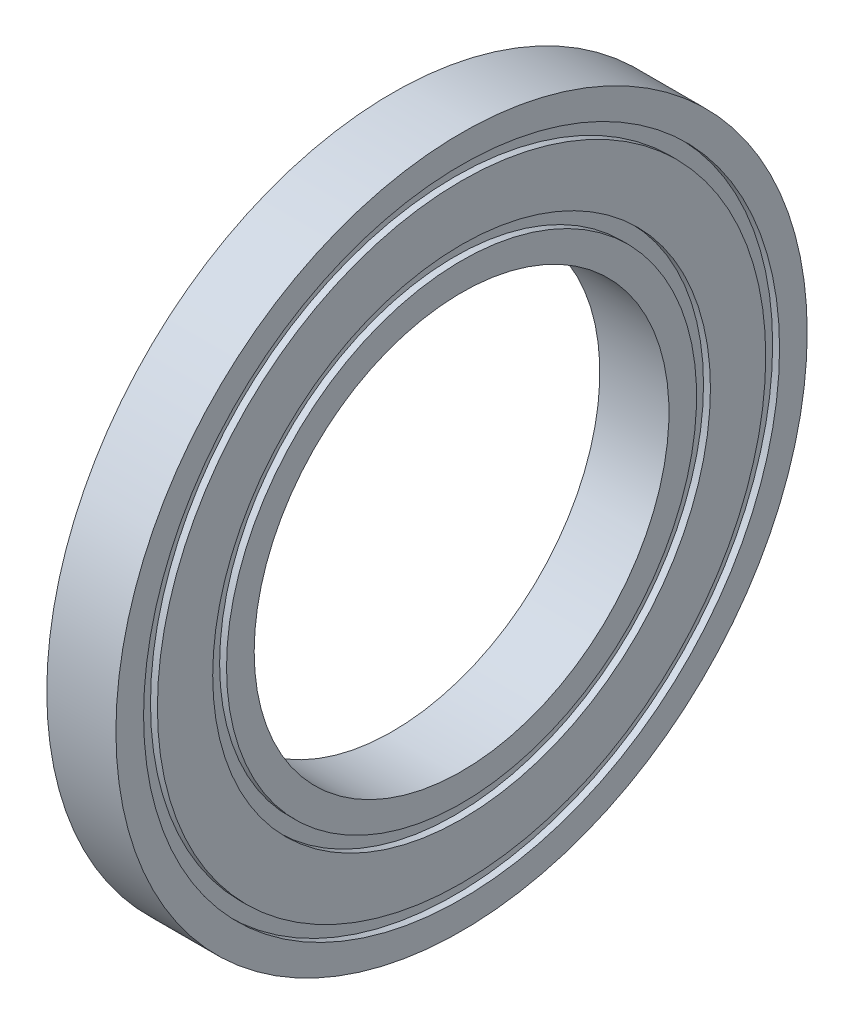
ISO-10303-21;
HEADER;
FILE_DESCRIPTION(('STEP AP214'),'2;1');
FILE_NAME('part.step','',(''),(''),'','','');
FILE_SCHEMA(('AUTOMOTIVE_DESIGN { 1 0 10303 214 1 1 1 1 }'));
ENDSEC;
DATA;
#1=APPLICATION_CONTEXT('core data for automotive mechanical design processes');
#2=APPLICATION_PROTOCOL_DEFINITION('international standard','automotive_design',2000,#1);
#3=PRODUCT_CONTEXT('',#1,'mechanical');
#4=PRODUCT('Part','Part','',(#3));
#5=PRODUCT_RELATED_PRODUCT_CATEGORY('part','',(#4));
#6=PRODUCT_DEFINITION_FORMATION('','',#4);
#7=PRODUCT_DEFINITION_CONTEXT('part definition',#1,'design');
#8=PRODUCT_DEFINITION('design','',#6,#7);
#9=PRODUCT_DEFINITION_SHAPE('','',#8);
#10=(LENGTH_UNIT() NAMED_UNIT(*) SI_UNIT(.MILLI.,.METRE.));
#11=(NAMED_UNIT(*) PLANE_ANGLE_UNIT() SI_UNIT($,.RADIAN.));
#12=(NAMED_UNIT(*) SI_UNIT($,.STERADIAN.) SOLID_ANGLE_UNIT());
#13=UNCERTAINTY_MEASURE_WITH_UNIT(LENGTH_MEASURE(1.E-05),#10,'distance_accuracy_value','');
#14=(GEOMETRIC_REPRESENTATION_CONTEXT(3) GLOBAL_UNCERTAINTY_ASSIGNED_CONTEXT((#13)) GLOBAL_UNIT_ASSIGNED_CONTEXT((#10,
#11,#12)) REPRESENTATION_CONTEXT('',''));
#15=CARTESIAN_POINT('',(0.,0.,0.));
#16=DIRECTION('',(0.,0.,1.));
#17=DIRECTION('',(1.,0.,0.));
#18=AXIS2_PLACEMENT_3D('',#15,#16,#17);
#19=CARTESIAN_POINT('',(2.,23.,0.));
#20=DIRECTION('',(-1.,0.,0.));
#21=DIRECTION('',(0.,0.,1.));
#22=AXIS2_PLACEMENT_3D('',#19,#20,#21);
#23=PLANE('',#22);
#24=CARTESIAN_POINT('',(2.,0.,0.));
#25=DIRECTION('',(-1.,0.,0.));
#26=DIRECTION('',(0.,0.,1.));
#27=AXIS2_PLACEMENT_3D('',#24,#25,#26);
#28=CIRCLE('',#27,23.);
#29=CARTESIAN_POINT('',(2.,0.,23.));
#30=VERTEX_POINT('',#29);
#31=EDGE_CURVE('E10',#30,#30,#28,.T.);
#32=ORIENTED_EDGE('',*,*,#31,.F.);
#33=EDGE_LOOP('',(#32));
#34=FACE_BOUND('',#33,.T.);
#35=CARTESIAN_POINT('',(2.,0.,0.));
#36=DIRECTION('',(-1.,0.,0.));
#37=DIRECTION('',(0.,0.,1.));
#38=AXIS2_PLACEMENT_3D('',#35,#36,#37);
#39=CIRCLE('',#38,22.);
#40=CARTESIAN_POINT('',(2.,0.,22.));
#41=VERTEX_POINT('',#40);
#42=EDGE_CURVE('E103',#41,#41,#39,.T.);
#43=ORIENTED_EDGE('',*,*,#42,.T.);
#44=EDGE_LOOP('',(#43));
#45=FACE_BOUND('',#44,.T.);
#46=ADVANCED_FACE('F39',(#34,#45),#23,.F.);
#47=CARTESIAN_POINT('',(0.,0.,0.));
#48=DIRECTION('',(-1.,0.,0.));
#49=DIRECTION('',(0.,0.,1.));
#50=AXIS2_PLACEMENT_3D('',#47,#48,#49);
#51=CYLINDRICAL_SURFACE('',#50,23.);
#52=CARTESIAN_POINT('',(2.5,0.,0.));
#53=DIRECTION('',(-1.,0.,0.));
#54=DIRECTION('',(0.,0.,1.));
#55=AXIS2_PLACEMENT_3D('',#52,#53,#54);
#56=CIRCLE('',#55,23.);
#57=CARTESIAN_POINT('',(2.5,0.,23.));
#58=VERTEX_POINT('',#57);
#59=EDGE_CURVE('E45',#58,#58,#56,.T.);
#60=ORIENTED_EDGE('',*,*,#59,.F.);
#61=EDGE_LOOP('',(#60));
#62=FACE_BOUND('',#61,.T.);
#63=ORIENTED_EDGE('',*,*,#31,.T.);
#64=EDGE_LOOP('',(#63));
#65=FACE_BOUND('',#64,.T.);
#66=ADVANCED_FACE('F212',(#62,#65),#51,.F.);
#67=CARTESIAN_POINT('',(2.5,25.,0.));
#68=DIRECTION('',(-1.,0.,0.));
#69=DIRECTION('',(0.,0.,1.));
#70=AXIS2_PLACEMENT_3D('',#67,#68,#69);
#71=PLANE('',#70);
#72=CARTESIAN_POINT('',(2.5,0.,0.));
#73=DIRECTION('',(-1.,0.,0.));
#74=DIRECTION('',(0.,0.,1.));
#75=AXIS2_PLACEMENT_3D('',#72,#73,#74);
#76=CIRCLE('',#75,25.);
#77=CARTESIAN_POINT('',(2.5,0.,25.));
#78=VERTEX_POINT('',#77);
#79=EDGE_CURVE('E49',#78,#78,#76,.T.);
#80=ORIENTED_EDGE('',*,*,#79,.F.);
#81=EDGE_LOOP('',(#80));
#82=FACE_BOUND('',#81,.T.);
#83=ORIENTED_EDGE('',*,*,#59,.T.);
#84=EDGE_LOOP('',(#83));
#85=FACE_BOUND('',#84,.T.);
#86=ADVANCED_FACE('F207',(#82,#85),#71,.F.);
#87=CARTESIAN_POINT('',(0.,0.,0.));
#88=DIRECTION('',(-1.,0.,0.));
#89=DIRECTION('',(0.,0.,1.));
#90=AXIS2_PLACEMENT_3D('',#87,#88,#89);
#91=CYLINDRICAL_SURFACE('',#90,25.);
#92=CARTESIAN_POINT('',(-2.5,0.,0.));
#93=DIRECTION('',(-1.,0.,0.));
#94=DIRECTION('',(0.,0.,1.));
#95=AXIS2_PLACEMENT_3D('',#92,#93,#94);
#96=CIRCLE('',#95,25.);
#97=CARTESIAN_POINT('',(-2.5,0.,25.));
#98=VERTEX_POINT('',#97);
#99=EDGE_CURVE('E53',#98,#98,#96,.T.);
#100=ORIENTED_EDGE('',*,*,#99,.F.);
#101=EDGE_LOOP('',(#100));
#102=FACE_BOUND('',#101,.T.);
#103=ORIENTED_EDGE('',*,*,#79,.T.);
#104=EDGE_LOOP('',(#103));
#105=FACE_BOUND('',#104,.T.);
#106=ADVANCED_FACE('F201',(#102,#105),#91,.T.);
#107=CARTESIAN_POINT('',(-2.5,25.,0.));
#108=DIRECTION('',(1.,0.,0.));
#109=DIRECTION('',(0.,0.,-1.));
#110=AXIS2_PLACEMENT_3D('',#107,#108,#109);
#111=PLANE('',#110);
#112=CARTESIAN_POINT('',(-2.5,0.,0.));
#113=DIRECTION('',(-1.,0.,0.));
#114=DIRECTION('',(0.,0.,1.));
#115=AXIS2_PLACEMENT_3D('',#112,#113,#114);
#116=CIRCLE('',#115,23.);
#117=CARTESIAN_POINT('',(-2.5,0.,23.));
#118=VERTEX_POINT('',#117);
#119=EDGE_CURVE('E58',#118,#118,#116,.T.);
#120=ORIENTED_EDGE('',*,*,#119,.F.);
#121=EDGE_LOOP('',(#120));
#122=FACE_BOUND('',#121,.T.);
#123=ORIENTED_EDGE('',*,*,#99,.T.);
#124=EDGE_LOOP('',(#123));
#125=FACE_BOUND('',#124,.T.);
#126=ADVANCED_FACE('F195',(#122,#125),#111,.F.);
#127=CARTESIAN_POINT('',(0.,0.,0.));
#128=DIRECTION('',(-1.,0.,0.));
#129=DIRECTION('',(0.,0.,1.));
#130=AXIS2_PLACEMENT_3D('',#127,#128,#129);
#131=CYLINDRICAL_SURFACE('',#130,23.);
#132=CARTESIAN_POINT('',(-2.,0.,0.));
#133=DIRECTION('',(-1.,0.,0.));
#134=DIRECTION('',(0.,0.,1.));
#135=AXIS2_PLACEMENT_3D('',#132,#133,#134);
#136=CIRCLE('',#135,23.);
#137=CARTESIAN_POINT('',(-2.,0.,23.));
#138=VERTEX_POINT('',#137);
#139=EDGE_CURVE('E61',#138,#138,#136,.T.);
#140=ORIENTED_EDGE('',*,*,#139,.F.);
#141=EDGE_LOOP('',(#140));
#142=FACE_BOUND('',#141,.T.);
#143=ORIENTED_EDGE('',*,*,#119,.T.);
#144=EDGE_LOOP('',(#143));
#145=FACE_BOUND('',#144,.T.);
#146=ADVANCED_FACE('F189',(#142,#145),#131,.F.);
#147=CARTESIAN_POINT('',(-2.,23.,0.));
#148=DIRECTION('',(1.,0.,0.));
#149=DIRECTION('',(0.,0.,-1.));
#150=AXIS2_PLACEMENT_3D('',#147,#148,#149);
#151=PLANE('',#150);
#152=CARTESIAN_POINT('',(-2.,0.,0.));
#153=DIRECTION('',(-1.,0.,0.));
#154=DIRECTION('',(0.,0.,1.));
#155=AXIS2_PLACEMENT_3D('',#152,#153,#154);
#156=CIRCLE('',#155,22.);
#157=CARTESIAN_POINT('',(-2.,0.,22.));
#158=VERTEX_POINT('',#157);
#159=EDGE_CURVE('E64',#158,#158,#156,.T.);
#160=ORIENTED_EDGE('',*,*,#159,.F.);
#161=EDGE_LOOP('',(#160));
#162=FACE_BOUND('',#161,.T.);
#163=ORIENTED_EDGE('',*,*,#139,.T.);
#164=EDGE_LOOP('',(#163));
#165=FACE_BOUND('',#164,.T.);
#166=ADVANCED_FACE('F183',(#162,#165),#151,.F.);
#167=CARTESIAN_POINT('',(0.,0.,0.));
#168=DIRECTION('',(-1.,0.,0.));
#169=DIRECTION('',(0.,0.,1.));
#170=AXIS2_PLACEMENT_3D('',#167,#168,#169);
#171=CYLINDRICAL_SURFACE('',#170,22.);
#172=CARTESIAN_POINT('',(-2.5,0.,0.));
#173=DIRECTION('',(-1.,0.,0.));
#174=DIRECTION('',(0.,0.,1.));
#175=AXIS2_PLACEMENT_3D('',#172,#173,#174);
#176=CIRCLE('',#175,22.);
#177=CARTESIAN_POINT('',(-2.5,0.,22.));
#178=VERTEX_POINT('',#177);
#179=EDGE_CURVE('E67',#178,#178,#176,.T.);
#180=ORIENTED_EDGE('',*,*,#179,.F.);
#181=EDGE_LOOP('',(#180));
#182=FACE_BOUND('',#181,.T.);
#183=ORIENTED_EDGE('',*,*,#159,.T.);
#184=EDGE_LOOP('',(#183));
#185=FACE_BOUND('',#184,.T.);
#186=ADVANCED_FACE('F177',(#182,#185),#171,.T.);
#187=CARTESIAN_POINT('',(-2.5,22.,0.));
#188=DIRECTION('',(1.,0.,0.));
#189=DIRECTION('',(0.,0.,-1.));
#190=AXIS2_PLACEMENT_3D('',#187,#188,#189);
#191=PLANE('',#190);
#192=CARTESIAN_POINT('',(-2.5,0.,0.));
#193=DIRECTION('',(-1.,0.,0.));
#194=DIRECTION('',(0.,0.,1.));
#195=AXIS2_PLACEMENT_3D('',#192,#193,#194);
#196=CIRCLE('',#195,18.);
#197=CARTESIAN_POINT('',(-2.5,0.,18.));
#198=VERTEX_POINT('',#197);
#199=EDGE_CURVE('E70',#198,#198,#196,.T.);
#200=ORIENTED_EDGE('',*,*,#199,.F.);
#201=EDGE_LOOP('',(#200));
#202=FACE_BOUND('',#201,.T.);
#203=ORIENTED_EDGE('',*,*,#179,.T.);
#204=EDGE_LOOP('',(#203));
#205=FACE_BOUND('',#204,.T.);
#206=ADVANCED_FACE('F171',(#202,#205),#191,.F.);
#207=CARTESIAN_POINT('',(0.,0.,0.));
#208=DIRECTION('',(-1.,0.,0.));
#209=DIRECTION('',(0.,0.,1.));
#210=AXIS2_PLACEMENT_3D('',#207,#208,#209);
#211=CYLINDRICAL_SURFACE('',#210,18.);
#212=CARTESIAN_POINT('',(-2.,0.,0.));
#213=DIRECTION('',(-1.,0.,0.));
#214=DIRECTION('',(0.,0.,1.));
#215=AXIS2_PLACEMENT_3D('',#212,#213,#214);
#216=CIRCLE('',#215,18.);
#217=CARTESIAN_POINT('',(-2.,0.,18.));
#218=VERTEX_POINT('',#217);
#219=EDGE_CURVE('E73',#218,#218,#216,.T.);
#220=ORIENTED_EDGE('',*,*,#219,.F.);
#221=EDGE_LOOP('',(#220));
#222=FACE_BOUND('',#221,.T.);
#223=ORIENTED_EDGE('',*,*,#199,.T.);
#224=EDGE_LOOP('',(#223));
#225=FACE_BOUND('',#224,.T.);
#226=ADVANCED_FACE('F165',(#222,#225),#211,.F.);
#227=CARTESIAN_POINT('',(-2.,17.,0.));
#228=DIRECTION('',(1.,0.,0.));
#229=DIRECTION('',(0.,0.,-1.));
#230=AXIS2_PLACEMENT_3D('',#227,#228,#229);
#231=PLANE('',#230);
#232=CARTESIAN_POINT('',(-2.,0.,0.));
#233=DIRECTION('',(-1.,0.,0.));
#234=DIRECTION('',(0.,0.,1.));
#235=AXIS2_PLACEMENT_3D('',#232,#233,#234);
#236=CIRCLE('',#235,17.);
#237=CARTESIAN_POINT('',(-2.,0.,17.));
#238=VERTEX_POINT('',#237);
#239=EDGE_CURVE('E76',#238,#238,#236,.T.);
#240=ORIENTED_EDGE('',*,*,#239,.F.);
#241=EDGE_LOOP('',(#240));
#242=FACE_BOUND('',#241,.T.);
#243=ORIENTED_EDGE('',*,*,#219,.T.);
#244=EDGE_LOOP('',(#243));
#245=FACE_BOUND('',#244,.T.);
#246=ADVANCED_FACE('F159',(#242,#245),#231,.F.);
#247=CARTESIAN_POINT('',(0.,0.,0.));
#248=DIRECTION('',(-1.,0.,0.));
#249=DIRECTION('',(0.,0.,1.));
#250=AXIS2_PLACEMENT_3D('',#247,#248,#249);
#251=CYLINDRICAL_SURFACE('',#250,17.);
#252=CARTESIAN_POINT('',(-2.5,0.,0.));
#253=DIRECTION('',(-1.,0.,0.));
#254=DIRECTION('',(0.,0.,1.));
#255=AXIS2_PLACEMENT_3D('',#252,#253,#254);
#256=CIRCLE('',#255,17.);
#257=CARTESIAN_POINT('',(-2.5,0.,17.));
#258=VERTEX_POINT('',#257);
#259=EDGE_CURVE('E79',#258,#258,#256,.T.);
#260=ORIENTED_EDGE('',*,*,#259,.F.);
#261=EDGE_LOOP('',(#260));
#262=FACE_BOUND('',#261,.T.);
#263=ORIENTED_EDGE('',*,*,#239,.T.);
#264=EDGE_LOOP('',(#263));
#265=FACE_BOUND('',#264,.T.);
#266=ADVANCED_FACE('F153',(#262,#265),#251,.T.);
#267=CARTESIAN_POINT('',(-2.5,15.,0.));
#268=DIRECTION('',(1.,0.,0.));
#269=DIRECTION('',(0.,0.,-1.));
#270=AXIS2_PLACEMENT_3D('',#267,#268,#269);
#271=PLANE('',#270);
#272=CARTESIAN_POINT('',(-2.5,0.,0.));
#273=DIRECTION('',(-1.,0.,0.));
#274=DIRECTION('',(0.,0.,1.));
#275=AXIS2_PLACEMENT_3D('',#272,#273,#274);
#276=CIRCLE('',#275,15.);
#277=CARTESIAN_POINT('',(-2.5,0.,15.));
#278=VERTEX_POINT('',#277);
#279=EDGE_CURVE('E82',#278,#278,#276,.T.);
#280=ORIENTED_EDGE('',*,*,#279,.F.);
#281=EDGE_LOOP('',(#280));
#282=FACE_BOUND('',#281,.T.);
#283=ORIENTED_EDGE('',*,*,#259,.T.);
#284=EDGE_LOOP('',(#283));
#285=FACE_BOUND('',#284,.T.);
#286=ADVANCED_FACE('F147',(#282,#285),#271,.F.);
#287=CARTESIAN_POINT('',(0.,0.,0.));
#288=DIRECTION('',(-1.,0.,0.));
#289=DIRECTION('',(0.,0.,1.));
#290=AXIS2_PLACEMENT_3D('',#287,#288,#289);
#291=CYLINDRICAL_SURFACE('',#290,15.);
#292=CARTESIAN_POINT('',(2.5,0.,0.));
#293=DIRECTION('',(-1.,0.,0.));
#294=DIRECTION('',(0.,0.,1.));
#295=AXIS2_PLACEMENT_3D('',#292,#293,#294);
#296=CIRCLE('',#295,15.);
#297=CARTESIAN_POINT('',(2.5,0.,15.));
#298=VERTEX_POINT('',#297);
#299=EDGE_CURVE('E85',#298,#298,#296,.T.);
#300=ORIENTED_EDGE('',*,*,#299,.F.);
#301=EDGE_LOOP('',(#300));
#302=FACE_BOUND('',#301,.T.);
#303=ORIENTED_EDGE('',*,*,#279,.T.);
#304=EDGE_LOOP('',(#303));
#305=FACE_BOUND('',#304,.T.);
#306=ADVANCED_FACE('F141',(#302,#305),#291,.F.);
#307=CARTESIAN_POINT('',(2.5,15.,0.));
#308=DIRECTION('',(-1.,0.,0.));
#309=DIRECTION('',(0.,0.,1.));
#310=AXIS2_PLACEMENT_3D('',#307,#308,#309);
#311=PLANE('',#310);
#312=CARTESIAN_POINT('',(2.5,0.,0.));
#313=DIRECTION('',(-1.,0.,0.));
#314=DIRECTION('',(0.,0.,1.));
#315=AXIS2_PLACEMENT_3D('',#312,#313,#314);
#316=CIRCLE('',#315,17.);
#317=CARTESIAN_POINT('',(2.5,0.,17.));
#318=VERTEX_POINT('',#317);
#319=EDGE_CURVE('E88',#318,#318,#316,.T.);
#320=ORIENTED_EDGE('',*,*,#319,.F.);
#321=EDGE_LOOP('',(#320));
#322=FACE_BOUND('',#321,.T.);
#323=ORIENTED_EDGE('',*,*,#299,.T.);
#324=EDGE_LOOP('',(#323));
#325=FACE_BOUND('',#324,.T.);
#326=ADVANCED_FACE('F135',(#322,#325),#311,.F.);
#327=CARTESIAN_POINT('',(0.,0.,0.));
#328=DIRECTION('',(-1.,0.,0.));
#329=DIRECTION('',(0.,0.,1.));
#330=AXIS2_PLACEMENT_3D('',#327,#328,#329);
#331=CYLINDRICAL_SURFACE('',#330,17.);
#332=CARTESIAN_POINT('',(2.,0.,0.));
#333=DIRECTION('',(-1.,0.,0.));
#334=DIRECTION('',(0.,0.,1.));
#335=AXIS2_PLACEMENT_3D('',#332,#333,#334);
#336=CIRCLE('',#335,17.);
#337=CARTESIAN_POINT('',(2.,0.,17.));
#338=VERTEX_POINT('',#337);
#339=EDGE_CURVE('E91',#338,#338,#336,.T.);
#340=ORIENTED_EDGE('',*,*,#339,.F.);
#341=EDGE_LOOP('',(#340));
#342=FACE_BOUND('',#341,.T.);
#343=ORIENTED_EDGE('',*,*,#319,.T.);
#344=EDGE_LOOP('',(#343));
#345=FACE_BOUND('',#344,.T.);
#346=ADVANCED_FACE('F129',(#342,#345),#331,.T.);
#347=CARTESIAN_POINT('',(2.,17.,0.));
#348=DIRECTION('',(-1.,0.,0.));
#349=DIRECTION('',(0.,0.,1.));
#350=AXIS2_PLACEMENT_3D('',#347,#348,#349);
#351=PLANE('',#350);
#352=CARTESIAN_POINT('',(2.,0.,0.));
#353=DIRECTION('',(-1.,0.,0.));
#354=DIRECTION('',(0.,0.,1.));
#355=AXIS2_PLACEMENT_3D('',#352,#353,#354);
#356=CIRCLE('',#355,18.);
#357=CARTESIAN_POINT('',(2.,0.,18.));
#358=VERTEX_POINT('',#357);
#359=EDGE_CURVE('E94',#358,#358,#356,.T.);
#360=ORIENTED_EDGE('',*,*,#359,.F.);
#361=EDGE_LOOP('',(#360));
#362=FACE_BOUND('',#361,.T.);
#363=ORIENTED_EDGE('',*,*,#339,.T.);
#364=EDGE_LOOP('',(#363));
#365=FACE_BOUND('',#364,.T.);
#366=ADVANCED_FACE('F123',(#362,#365),#351,.F.);
#367=CARTESIAN_POINT('',(0.,0.,0.));
#368=DIRECTION('',(-1.,0.,0.));
#369=DIRECTION('',(0.,0.,1.));
#370=AXIS2_PLACEMENT_3D('',#367,#368,#369);
#371=CYLINDRICAL_SURFACE('',#370,18.);
#372=CARTESIAN_POINT('',(2.5,0.,0.));
#373=DIRECTION('',(-1.,0.,0.));
#374=DIRECTION('',(0.,0.,1.));
#375=AXIS2_PLACEMENT_3D('',#372,#373,#374);
#376=CIRCLE('',#375,18.);
#377=CARTESIAN_POINT('',(2.5,0.,18.));
#378=VERTEX_POINT('',#377);
#379=EDGE_CURVE('E97',#378,#378,#376,.T.);
#380=ORIENTED_EDGE('',*,*,#379,.F.);
#381=EDGE_LOOP('',(#380));
#382=FACE_BOUND('',#381,.T.);
#383=ORIENTED_EDGE('',*,*,#359,.T.);
#384=EDGE_LOOP('',(#383));
#385=FACE_BOUND('',#384,.T.);
#386=ADVANCED_FACE('F117',(#382,#385),#371,.F.);
#387=CARTESIAN_POINT('',(2.5,22.,0.));
#388=DIRECTION('',(-1.,0.,0.));
#389=DIRECTION('',(0.,0.,1.));
#390=AXIS2_PLACEMENT_3D('',#387,#388,#389);
#391=PLANE('',#390);
#392=CARTESIAN_POINT('',(2.5,0.,0.));
#393=DIRECTION('',(-1.,0.,0.));
#394=DIRECTION('',(0.,0.,1.));
#395=AXIS2_PLACEMENT_3D('',#392,#393,#394);
#396=CIRCLE('',#395,22.);
#397=CARTESIAN_POINT('',(2.5,0.,22.));
#398=VERTEX_POINT('',#397);
#399=EDGE_CURVE('E100',#398,#398,#396,.T.);
#400=ORIENTED_EDGE('',*,*,#399,.F.);
#401=EDGE_LOOP('',(#400));
#402=FACE_BOUND('',#401,.T.);
#403=ORIENTED_EDGE('',*,*,#379,.T.);
#404=EDGE_LOOP('',(#403));
#405=FACE_BOUND('',#404,.T.);
#406=ADVANCED_FACE('F111',(#402,#405),#391,.F.);
#407=CARTESIAN_POINT('',(0.,0.,0.));
#408=DIRECTION('',(-1.,0.,0.));
#409=DIRECTION('',(0.,0.,1.));
#410=AXIS2_PLACEMENT_3D('',#407,#408,#409);
#411=CYLINDRICAL_SURFACE('',#410,22.);
#412=ORIENTED_EDGE('',*,*,#42,.F.);
#413=EDGE_LOOP('',(#412));
#414=FACE_BOUND('',#413,.T.);
#415=ORIENTED_EDGE('',*,*,#399,.T.);
#416=EDGE_LOOP('',(#415));
#417=FACE_BOUND('',#416,.T.);
#418=ADVANCED_FACE('F108',(#414,#417),#411,.T.);
#419=CLOSED_SHELL('',(#46,#66,#86,#106,#126,#146,#166,#186,#206,#226,#246,#266,#286,#306,#326,
#346,#366,#386,#406,#418));
#420=MANIFOLD_SOLID_BREP('B2',#419);
#421=ADVANCED_BREP_SHAPE_REPRESENTATION('',(#18,#420),#14);
#422=SHAPE_DEFINITION_REPRESENTATION(#9,#421);
ENDSEC;
END-ISO-10303-21;
